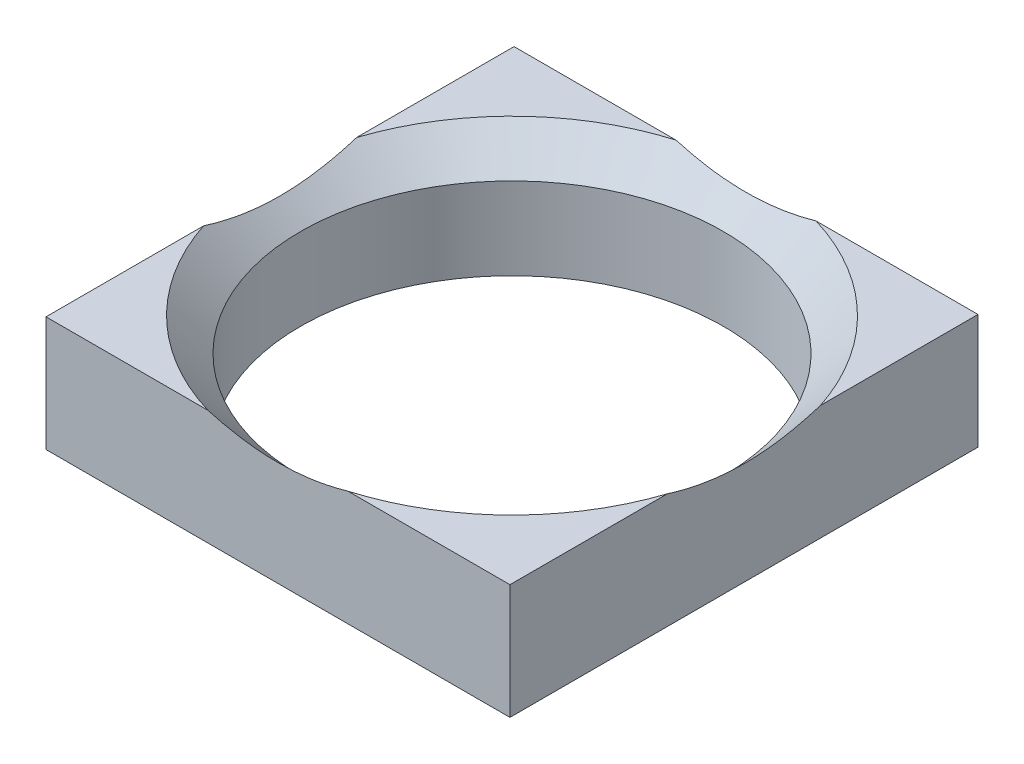
ISO-10303-21;
HEADER;
FILE_DESCRIPTION(('STEP AP214'),'2;1');
FILE_NAME('part.step','',(''),(''),'','','');
FILE_SCHEMA(('AUTOMOTIVE_DESIGN { 1 0 10303 214 1 1 1 1 }'));
ENDSEC;
DATA;
#1=APPLICATION_CONTEXT('core data for automotive mechanical design processes');
#2=APPLICATION_PROTOCOL_DEFINITION('international standard','automotive_design',2000,#1);
#3=PRODUCT_CONTEXT('',#1,'mechanical');
#4=PRODUCT('Part','Part','',(#3));
#5=PRODUCT_RELATED_PRODUCT_CATEGORY('part','',(#4));
#6=PRODUCT_DEFINITION_FORMATION('','',#4);
#7=PRODUCT_DEFINITION_CONTEXT('part definition',#1,'design');
#8=PRODUCT_DEFINITION('design','',#6,#7);
#9=PRODUCT_DEFINITION_SHAPE('','',#8);
#10=(LENGTH_UNIT() NAMED_UNIT(*) SI_UNIT(.MILLI.,.METRE.));
#11=(NAMED_UNIT(*) PLANE_ANGLE_UNIT() SI_UNIT($,.RADIAN.));
#12=(NAMED_UNIT(*) SI_UNIT($,.STERADIAN.) SOLID_ANGLE_UNIT());
#13=UNCERTAINTY_MEASURE_WITH_UNIT(LENGTH_MEASURE(1.E-05),#10,'distance_accuracy_value','');
#14=(GEOMETRIC_REPRESENTATION_CONTEXT(3) GLOBAL_UNCERTAINTY_ASSIGNED_CONTEXT((#13)) GLOBAL_UNIT_ASSIGNED_CONTEXT((#10,
#11,#12)) REPRESENTATION_CONTEXT('',''));
#15=CARTESIAN_POINT('',(0.,0.,0.));
#16=DIRECTION('',(0.,0.,1.));
#17=DIRECTION('',(1.,0.,0.));
#18=AXIS2_PLACEMENT_3D('',#15,#16,#17);
#19=CARTESIAN_POINT('',(0.,2.8,0.));
#20=DIRECTION('',(0.,1.,0.));
#21=DIRECTION('',(0.,0.,1.));
#22=AXIS2_PLACEMENT_3D('',#19,#20,#21);
#23=PLANE('',#22);
#24=DIRECTION('',(0.,0.,1.));
#25=VECTOR('',#24,1.);
#26=CARTESIAN_POINT('',(-5.65,2.8,-5.7));
#27=LINE('',#26,#25);
#28=CARTESIAN_POINT('',(-5.65,2.8,1.86547581061778));
#29=VERTEX_POINT('',#28);
#30=CARTESIAN_POINT('',(-5.65,2.8,5.7));
#31=VERTEX_POINT('',#30);
#32=EDGE_CURVE('E159',#29,#31,#27,.T.);
#33=ORIENTED_EDGE('',*,*,#32,.T.);
#34=DIRECTION('',(1.,0.,0.));
#35=VECTOR('',#34,1.);
#36=CARTESIAN_POINT('',(-5.65,2.8,5.7));
#37=LINE('',#36,#35);
#38=CARTESIAN_POINT('',(-1.70660481658761,2.8,5.7));
#39=VERTEX_POINT('',#38);
#40=EDGE_CURVE('E125',#31,#39,#37,.T.);
#41=ORIENTED_EDGE('',*,*,#40,.T.);
#42=CARTESIAN_POINT('',(0.,2.8,0.));
#43=DIRECTION('',(0.,1.,0.));
#44=DIRECTION('',(0.,0.,1.));
#45=AXIS2_PLACEMENT_3D('',#42,#43,#44);
#46=CIRCLE('',#45,5.95000000000001);
#47=EDGE_CURVE('E183',#39,#29,#46,.F.);
#48=ORIENTED_EDGE('',*,*,#47,.T.);
#49=EDGE_LOOP('',(#33,#41,#48));
#50=FACE_BOUND('',#49,.T.);
#51=ADVANCED_FACE('F50',(#50),#23,.T.);
#52=DIRECTION('',(-1.,0.,0.));
#53=VECTOR('',#52,1.);
#54=CARTESIAN_POINT('',(-5.65,2.8,-5.7));
#55=LINE('',#54,#53);
#56=CARTESIAN_POINT('',(-1.70660481658762,2.8,-5.7));
#57=VERTEX_POINT('',#56);
#58=CARTESIAN_POINT('',(-5.65,2.8,-5.7));
#59=VERTEX_POINT('',#58);
#60=EDGE_CURVE('E77',#57,#59,#55,.T.);
#61=ORIENTED_EDGE('',*,*,#60,.T.);
#62=CARTESIAN_POINT('',(-5.65,2.8,-1.86547581061778));
#63=VERTEX_POINT('',#62);
#64=EDGE_CURVE('E160',#59,#63,#27,.T.);
#65=ORIENTED_EDGE('',*,*,#64,.T.);
#66=CARTESIAN_POINT('',(0.,2.8,0.));
#67=DIRECTION('',(0.,1.,0.));
#68=DIRECTION('',(0.,0.,1.));
#69=AXIS2_PLACEMENT_3D('',#66,#67,#68);
#70=CIRCLE('',#69,5.95000000000001);
#71=EDGE_CURVE('E179',#63,#57,#70,.F.);
#72=ORIENTED_EDGE('',*,*,#71,.T.);
#73=EDGE_LOOP('',(#61,#65,#72));
#74=FACE_BOUND('',#73,.T.);
#75=ADVANCED_FACE('F234',(#74),#23,.T.);
#76=CARTESIAN_POINT('',(0.,2.8,0.));
#77=DIRECTION('',(0.,1.,0.));
#78=DIRECTION('',(0.,0.,1.));
#79=AXIS2_PLACEMENT_3D('',#76,#77,#78);
#80=CIRCLE('',#79,5.95000000000001);
#81=CARTESIAN_POINT('',(1.70660481658763,2.8,-5.7));
#82=VERTEX_POINT('',#81);
#83=CARTESIAN_POINT('',(5.65,2.8,-1.86547581061778));
#84=VERTEX_POINT('',#83);
#85=EDGE_CURVE('E175',#82,#84,#80,.F.);
#86=ORIENTED_EDGE('',*,*,#85,.T.);
#87=DIRECTION('',(0.,0.,-1.));
#88=VECTOR('',#87,1.);
#89=CARTESIAN_POINT('',(5.65,2.8,-5.7));
#90=LINE('',#89,#88);
#91=CARTESIAN_POINT('',(5.65,2.8,-5.7));
#92=VERTEX_POINT('',#91);
#93=EDGE_CURVE('E154',#84,#92,#90,.T.);
#94=ORIENTED_EDGE('',*,*,#93,.T.);
#95=EDGE_CURVE('E155',#92,#82,#55,.T.);
#96=ORIENTED_EDGE('',*,*,#95,.T.);
#97=EDGE_LOOP('',(#86,#94,#96));
#98=FACE_BOUND('',#97,.T.);
#99=ADVANCED_FACE('F240',(#98),#23,.T.);
#100=CARTESIAN_POINT('',(1.70660481658762,2.8,5.7));
#101=VERTEX_POINT('',#100);
#102=CARTESIAN_POINT('',(5.65,2.8,5.7));
#103=VERTEX_POINT('',#102);
#104=EDGE_CURVE('E164',#101,#103,#37,.T.);
#105=ORIENTED_EDGE('',*,*,#104,.T.);
#106=CARTESIAN_POINT('',(5.65,2.8,1.86547581061778));
#107=VERTEX_POINT('',#106);
#108=EDGE_CURVE('E150',#103,#107,#90,.T.);
#109=ORIENTED_EDGE('',*,*,#108,.T.);
#110=CARTESIAN_POINT('',(0.,2.8,0.));
#111=DIRECTION('',(0.,1.,0.));
#112=DIRECTION('',(0.,0.,1.));
#113=AXIS2_PLACEMENT_3D('',#110,#111,#112);
#114=CIRCLE('',#113,5.95000000000001);
#115=EDGE_CURVE('E168',#107,#101,#114,.F.);
#116=ORIENTED_EDGE('',*,*,#115,.T.);
#117=EDGE_LOOP('',(#105,#109,#116));
#118=FACE_BOUND('',#117,.T.);
#119=ADVANCED_FACE('F236',(#118),#23,.T.);
#120=CARTESIAN_POINT('',(0.,0.,0.));
#121=DIRECTION('',(0.,1.,0.));
#122=DIRECTION('',(0.,0.,1.));
#123=AXIS2_PLACEMENT_3D('',#120,#121,#122);
#124=PLANE('',#123);
#125=CARTESIAN_POINT('',(0.,0.,0.));
#126=DIRECTION('',(0.,1.,0.));
#127=DIRECTION('',(0.,0.,1.));
#128=AXIS2_PLACEMENT_3D('',#125,#126,#127);
#129=CIRCLE('',#128,5.15);
#130=CARTESIAN_POINT('',(0.,0.,5.15));
#131=VERTEX_POINT('',#130);
#132=EDGE_CURVE('E261',#131,#131,#129,.T.);
#133=ORIENTED_EDGE('',*,*,#132,.T.);
#134=EDGE_LOOP('',(#133));
#135=FACE_BOUND('',#134,.T.);
#136=DIRECTION('',(0.,0.,-1.));
#137=VECTOR('',#136,1.);
#138=CARTESIAN_POINT('',(5.65,0.,-5.7));
#139=LINE('',#138,#137);
#140=CARTESIAN_POINT('',(5.65,0.,5.7));
#141=VERTEX_POINT('',#140);
#142=CARTESIAN_POINT('',(5.65,0.,-5.7));
#143=VERTEX_POINT('',#142);
#144=EDGE_CURVE('E69',#141,#143,#139,.T.);
#145=ORIENTED_EDGE('',*,*,#144,.F.);
#146=DIRECTION('',(1.,0.,0.));
#147=VECTOR('',#146,1.);
#148=CARTESIAN_POINT('',(-5.65,0.,5.7));
#149=LINE('',#148,#147);
#150=CARTESIAN_POINT('',(-5.65,0.,5.7));
#151=VERTEX_POINT('',#150);
#152=EDGE_CURVE('E123',#151,#141,#149,.T.);
#153=ORIENTED_EDGE('',*,*,#152,.F.);
#154=DIRECTION('',(0.,0.,1.));
#155=VECTOR('',#154,1.);
#156=CARTESIAN_POINT('',(-5.65,0.,-5.7));
#157=LINE('',#156,#155);
#158=CARTESIAN_POINT('',(-5.65,0.,-5.7));
#159=VERTEX_POINT('',#158);
#160=EDGE_CURVE('E133',#159,#151,#157,.T.);
#161=ORIENTED_EDGE('',*,*,#160,.F.);
#162=DIRECTION('',(-1.,0.,0.));
#163=VECTOR('',#162,1.);
#164=CARTESIAN_POINT('',(-5.65,0.,-5.7));
#165=LINE('',#164,#163);
#166=EDGE_CURVE('E140',#143,#159,#165,.T.);
#167=ORIENTED_EDGE('',*,*,#166,.F.);
#168=EDGE_LOOP('',(#145,#153,#161,#167));
#169=FACE_BOUND('',#168,.T.);
#170=ADVANCED_FACE('F142',(#135,#169),#124,.F.);
#171=CARTESIAN_POINT('',(0.,1.9,0.));
#172=DIRECTION('',(0.,1.,0.));
#173=DIRECTION('',(0.,0.,1.));
#174=AXIS2_PLACEMENT_3D('',#171,#172,#173);
#175=CONICAL_SURFACE('',#174,5.05,0.785398163397449);
#176=CARTESIAN_POINT('',(0.,2.,0.));
#177=DIRECTION('',(0.,1.,0.));
#178=DIRECTION('',(0.,0.,1.));
#179=AXIS2_PLACEMENT_3D('',#176,#177,#178);
#180=CIRCLE('',#179,5.15);
#181=CARTESIAN_POINT('',(0.,2.,5.15));
#182=VERTEX_POINT('',#181);
#183=EDGE_CURVE('E56',#182,#182,#180,.T.);
#184=ORIENTED_EDGE('',*,*,#183,.F.);
#185=EDGE_LOOP('',(#184));
#186=FACE_BOUND('',#185,.T.);
#187=ORIENTED_EDGE('',*,*,#115,.F.);
#188=CARTESIAN_POINT('',(5.65,14.2356711315276,16.4419907764733));
#189=CARTESIAN_POINT('',(5.65,13.9834431608052,16.175280783346));
#190=CARTESIAN_POINT('',(5.65,13.7315513959607,15.9082525352937));
#191=CARTESIAN_POINT('',(5.65,13.2285582947579,15.3734497304002));
#192=CARTESIAN_POINT('',(5.65,12.9774569631199,15.1056751691202));
#193=CARTESIAN_POINT('',(5.65,12.224979271577,14.3004933264489));
#194=CARTESIAN_POINT('',(5.65,11.7249740297578,13.7618029655425));
#195=CARTESIAN_POINT('',(5.65,10.7102549722765,12.6583310669776));
#196=CARTESIAN_POINT('',(5.65,10.195744291636,12.0933620750663));
#197=CARTESIAN_POINT('',(5.65,9.43024123348055,11.2407927536298));
#198=CARTESIAN_POINT('',(5.65,9.17624199182825,10.9558931278892));
#199=CARTESIAN_POINT('',(5.65,8.67073539087396,10.3838940481738));
#200=CARTESIAN_POINT('',(5.65,8.41922800526204,10.0967946174824));
#201=CARTESIAN_POINT('',(5.65,7.91965168161561,9.52026106112165));
#202=CARTESIAN_POINT('',(5.65,7.67157873905613,9.23083041115858));
#203=CARTESIAN_POINT('',(5.65,7.17939406809234,8.64858934151295));
#204=CARTESIAN_POINT('',(5.65,6.93528253264345,8.3557787583796));
#205=CARTESIAN_POINT('',(5.65,6.45145584700999,7.76494295627826));
#206=CARTESIAN_POINT('',(5.65,6.21175753898278,7.46690389613502));
#207=CARTESIAN_POINT('',(5.65,5.73937875355495,6.86536654384135));
#208=CARTESIAN_POINT('',(5.65,5.50669727052154,6.56186904402884));
#209=CARTESIAN_POINT('',(5.65,5.05511143160943,5.95334575659136));
#210=CARTESIAN_POINT('',(5.65,4.8360322952248,5.64845098293372));
#211=CARTESIAN_POINT('',(5.65,4.51719769270429,5.18420517330077));
#212=CARTESIAN_POINT('',(5.65,4.41251003273822,5.0282418298104));
#213=CARTESIAN_POINT('',(5.65,4.20713017558806,4.71371197537741));
#214=CARTESIAN_POINT('',(5.65,4.10643769667206,4.55514564911057));
#215=CARTESIAN_POINT('',(5.65,3.910435140708,4.23592074650746));
#216=CARTESIAN_POINT('',(5.65,3.81509828773573,4.07527867107234));
#217=CARTESIAN_POINT('',(5.65,3.63025870034071,3.75062950189142));
#218=CARTESIAN_POINT('',(5.65,3.54075664064924,3.58662202184565));
#219=CARTESIAN_POINT('',(5.65,3.36906281350419,3.25511241107166));
#220=CARTESIAN_POINT('',(5.65,3.28686044661249,3.08761579825439));
#221=CARTESIAN_POINT('',(5.65,3.1312904287907,2.74859544695919));
#222=CARTESIAN_POINT('',(5.65,3.05791939411052,2.57707328117852));
#223=CARTESIAN_POINT('',(5.65,2.9572788205528,2.3199671921801));
#224=CARTESIAN_POINT('',(5.65,2.92585230357156,2.2360023204772));
#225=CARTESIAN_POINT('',(5.65,2.86574147786503,2.06709425942965));
#226=CARTESIAN_POINT('',(5.65,2.83705727306549,1.98215103314477));
#227=CARTESIAN_POINT('',(5.65,2.75548594548319,1.72583094912809));
#228=CARTESIAN_POINT('',(5.65,2.70708937306983,1.55298699668785));
#229=CARTESIAN_POINT('',(5.65,2.62458989854584,1.20490419696493));
#230=CARTESIAN_POINT('',(5.65,2.59040888624463,1.02968405043943));
#231=CARTESIAN_POINT('',(5.65,2.53773017720199,0.676880469439015));
#232=CARTESIAN_POINT('',(5.65,2.51923063897448,0.499297314942012));
#233=CARTESIAN_POINT('',(5.65,2.49893708983897,0.141735066467987));
#234=CARTESIAN_POINT('',(5.65,2.49727792886429,-0.0382518291330582));
#235=CARTESIAN_POINT('',(5.65,2.51112262600359,-0.397549856811444));
#236=CARTESIAN_POINT('',(5.65,2.52662637884385,-0.576860993026981));
#237=CARTESIAN_POINT('',(5.65,2.57394371156385,-0.93409870929561));
#238=CARTESIAN_POINT('',(5.65,2.60582982507905,-1.11201552894643));
#239=CARTESIAN_POINT('',(5.65,2.68420344489631,-1.4645851807568));
#240=CARTESIAN_POINT('',(5.65,2.73069422713209,-1.63923727129227));
#241=CARTESIAN_POINT('',(5.65,2.86514169336354,-2.07951043743523));
#242=CARTESIAN_POINT('',(5.65,2.96185232949413,-2.34244938461772));
#243=CARTESIAN_POINT('',(5.65,3.17776408756711,-2.85890206246326));
#244=CARTESIAN_POINT('',(5.65,3.29698268633535,-3.11240828452949));
#245=CARTESIAN_POINT('',(5.65,3.48877199544683,-3.48746647604352));
#246=CARTESIAN_POINT('',(5.65,3.55521901631738,-3.61221567447878));
#247=CARTESIAN_POINT('',(5.65,3.69173193110206,-3.85972383098038));
#248=CARTESIAN_POINT('',(5.65,3.76179787114567,-3.98248276365106));
#249=CARTESIAN_POINT('',(5.65,3.9049903230094,-4.22612079987853));
#250=CARTESIAN_POINT('',(5.65,3.97811544264934,-4.34700072491578));
#251=CARTESIAN_POINT('',(5.65,4.12702707343492,-4.58709860951872));
#252=CARTESIAN_POINT('',(5.65,4.20281347208269,-4.70631663903932));
#253=CARTESIAN_POINT('',(5.65,4.46282941451896,-5.10674144186432));
#254=CARTESIAN_POINT('',(5.65,4.6524011642967,-5.38448418861714));
#255=CARTESIAN_POINT('',(5.65,5.04086297982449,-5.93339979935816));
#256=CARTESIAN_POINT('',(5.65,5.23975524827823,-6.20457108711733));
#257=CARTESIAN_POINT('',(5.65,5.64458790808262,-6.74192070421842));
#258=CARTESIAN_POINT('',(5.65,5.85053376541595,-7.00809490209259));
#259=CARTESIAN_POINT('',(5.65,6.26763124325532,-7.5362786592922));
#260=CARTESIAN_POINT('',(5.65,6.47878240506643,-7.79828858225348));
#261=CARTESIAN_POINT('',(5.65,6.90585933349731,-8.3198726193851));
#262=CARTESIAN_POINT('',(5.65,7.12179891213739,-8.57943539860998));
#263=CARTESIAN_POINT('',(5.65,7.55689840360805,-9.0958507678333));
#264=CARTESIAN_POINT('',(5.65,7.77605837634234,-9.35270330726452));
#265=CARTESIAN_POINT('',(5.65,8.21685962774348,-9.86406523435232));
#266=CARTESIAN_POINT('',(5.65,8.43849974126684,-10.1185756277062));
#267=CARTESIAN_POINT('',(5.65,8.88388433431273,-10.6257496062947));
#268=CARTESIAN_POINT('',(5.65,9.10762882991348,-10.8784131773928));
#269=CARTESIAN_POINT('',(5.65,9.73450695168554,-11.581445985536));
#270=CARTESIAN_POINT('',(5.65,10.1395463643158,-12.0301155339244));
#271=CARTESIAN_POINT('',(5.65,10.9536983675994,-12.9238392013321));
#272=CARTESIAN_POINT('',(5.65,11.3628114727187,-13.3688928504743));
#273=CARTESIAN_POINT('',(5.65,12.181287503301,-14.2532041625837));
#274=CARTESIAN_POINT('',(5.65,12.5906300916334,-14.6924806703086));
#275=CARTESIAN_POINT('',(5.65,13.4115893168912,-15.5687714350527));
#276=CARTESIAN_POINT('',(5.65,13.8232055759963,-16.0057860458666));
#277=CARTESIAN_POINT('',(5.65,14.2356711315276,-16.4419907764733));
#278=B_SPLINE_CURVE_WITH_KNOTS('',3,(#188,#189,#190,#191,#192,#193,#194,#195,#196,#197,#198,
#199,#200,#201,#202,#203,#204,#205,#206,#207,#208,#209,#210,#211,#212,#213,#214,#215,#216,#217,
#218,#219,#220,#221,#222,#223,#224,#225,#226,#227,#228,#229,#230,#231,#232,#233,#234,#235,#236,
#237,#238,#239,#240,#241,#242,#243,#244,#245,#246,#247,#248,#249,#250,#251,#252,#253,#254,#255,
#256,#257,#258,#259,#260,#261,#262,#263,#264,#265,#266,#267,#268,#269,#270,#271,#272,#273,#274,
#275,#276,#277),.UNSPECIFIED.,.F.,.F.,(4,2,2,2,2,2,2,2,2,2,2,2,2,2,2,2,2,2,2,2,2,2,2,2,2,2,2,2,
2,2,2,2,2,2,2,2,2,2,2,2,2,2,2,2,4),(0.,1.10126213544741,2.20253083484356,4.40744470841247,
6.69980643957724,7.84485030770269,8.98988207311766,10.1334418923467,11.2770572468221,
12.4243846631025,13.5715468583633,14.6975885010549,15.2610628563013,15.8244974056205,
16.384804209616,16.9451756925721,17.504719714598,18.0640486586338,18.3329667931033,
18.6018951147608,19.1398268551158,19.6747624742339,20.2096352667958,20.7487877257797,
21.2879368777338,21.8294939755765,22.3711726354685,23.2101457263906,24.0497729566531,
24.4737511022856,24.8977346535982,25.3215273126121,25.7453020785315,26.7538090904397,
27.7625556551845,28.7721024397947,29.7815605782384,30.7944567030651,31.8073716930481,
32.8198292923211,33.8322946334174,35.6456104090566,37.4591581681485,39.2604611416385,
41.0614732908355),.UNSPECIFIED.);
#279=EDGE_CURVE('E12',#107,#84,#278,.T.);
#280=ORIENTED_EDGE('',*,*,#279,.T.);
#281=ORIENTED_EDGE('',*,*,#85,.F.);
#282=CARTESIAN_POINT('',(16.3191680098527,14.1359840487546,-5.7));
#283=CARTESIAN_POINT('',(16.0569617222666,13.8884481796756,-5.7));
#284=CARTESIAN_POINT('',(15.7944367984937,13.6412495257761,-5.7));
#285=CARTESIAN_POINT('',(15.2686414500865,13.1476433278169,-5.7));
#286=CARTESIAN_POINT('',(15.0053710210415,12.9012357884564,-5.7));
#287=CARTESIAN_POINT('',(14.2137906429992,12.1629192880823,-5.7));
#288=CARTESIAN_POINT('',(13.6842015768552,11.672379826128,-5.7));
#289=CARTESIAN_POINT('',(12.6022328157818,10.6796106912601,-5.7));
#290=CARTESIAN_POINT('',(12.0496930502591,10.1775548706294,-5.7));
#291=CARTESIAN_POINT('',(11.2158552212608,9.430554106288,-5.7));
#292=CARTESIAN_POINT('',(10.9371900220354,9.1826711073318,-5.7));
#293=CARTESIAN_POINT('',(10.377724259114,8.68932861989904,-5.7));
#294=CARTESIAN_POINT('',(10.096923715028,8.44386910921374,-5.7));
#295=CARTESIAN_POINT('',(9.53299733915615,7.95621460388212,-5.7));
#296=CARTESIAN_POINT('',(9.24987416490724,7.71401654091263,-5.7));
#297=CARTESIAN_POINT('',(8.68038339313063,7.23343356715659,-5.7));
#298=CARTESIAN_POINT('',(8.39401566231841,6.99504881399591,-5.7));
#299=CARTESIAN_POINT('',(7.81642059050429,6.52257574329108,-5.7));
#300=CARTESIAN_POINT('',(7.5251819991805,6.2885011327738,-5.7));
#301=CARTESIAN_POINT('',(6.9375352802732,5.8269866725349,-5.7));
#302=CARTESIAN_POINT('',(6.64112778130061,5.59954602489932,-5.7));
#303=CARTESIAN_POINT('',(6.04616754326133,5.15704968823395,-5.7));
#304=CARTESIAN_POINT('',(5.74771713506303,4.941857691626,-5.7));
#305=CARTESIAN_POINT('',(5.29359133031512,4.62818794593662,-5.7));
#306=CARTESIAN_POINT('',(5.14108790831103,4.52511747140244,-5.7));
#307=CARTESIAN_POINT('',(4.83365372605299,4.32267017812123,-5.7));
#308=CARTESIAN_POINT('',(4.67872311642068,4.22329313145522,-5.7));
#309=CARTESIAN_POINT('',(4.36682987748475,4.02943955356524,-5.7));
#310=CARTESIAN_POINT('',(4.20988029423562,3.93494210211081,-5.7));
#311=CARTESIAN_POINT('',(3.89285678455552,3.75127783633262,-5.7));
#312=CARTESIAN_POINT('',(3.73278255471576,3.66211154312382,-5.7));
#313=CARTESIAN_POINT('',(3.40935907254307,3.49040446682783,-5.7));
#314=CARTESIAN_POINT('',(3.24601415051027,3.40785556486246,-5.7));
#315=CARTESIAN_POINT('',(2.91555645336341,3.25073048076243,-5.7));
#316=CARTESIAN_POINT('',(2.74844491440723,3.1761517277586,-5.7));
#317=CARTESIAN_POINT('',(2.49438346550459,3.07141195974828,-5.7));
#318=CARTESIAN_POINT('',(2.40892626487645,3.03761596827938,-5.7));
#319=CARTESIAN_POINT('',(2.23699045751278,2.97272692665027,-5.7));
#320=CARTESIAN_POINT('',(2.15051182313482,2.9416339498313,-5.7));
#321=CARTESIAN_POINT('',(1.88950855225789,2.85278964187801,-5.7));
#322=CARTESIAN_POINT('',(1.71343399667137,2.79948023369896,-5.7));
#323=CARTESIAN_POINT('',(1.35859349566342,2.70718532760334,-5.7));
#324=CARTESIAN_POINT('',(1.17984835761074,2.6681206591899,-5.7));
#325=CARTESIAN_POINT('',(0.819584338433574,2.60589036111064,-5.7));
#326=CARTESIAN_POINT('',(0.638065786703127,2.5827228581395,-5.7));
#327=CARTESIAN_POINT('',(0.271799401917556,2.55352879244794,-5.7));
#328=CARTESIAN_POINT('',(0.0870374320366984,2.54767613641807,-5.7));
#329=CARTESIAN_POINT('',(-0.282164903358449,2.55399368560354,-5.7));
#330=CARTESIAN_POINT('',(-0.466605279323058,2.56616329382341,-5.7));
#331=CARTESIAN_POINT('',(-0.834256897434177,2.60781777840016,-5.7));
#332=CARTESIAN_POINT('',(-1.01745994604432,2.63737377920101,-5.7));
#333=CARTESIAN_POINT('',(-1.38063206920966,2.71212600788908,-5.7));
#334=CARTESIAN_POINT('',(-1.56060031389964,2.75732619059482,-5.7));
#335=CARTESIAN_POINT('',(-2.00103923470839,2.88581985032233,-5.7));
#336=CARTESIAN_POINT('',(-2.25919514495635,2.9770121205502,-5.7));
#337=CARTESIAN_POINT('',(-2.7665091563681,3.18162759194298,-5.7));
#338=CARTESIAN_POINT('',(-3.01566085496749,3.29506625717413,-5.7));
#339=CARTESIAN_POINT('',(-3.38442287061537,3.47818471236272,-5.7));
#340=CARTESIAN_POINT('',(-3.50713706308212,3.54174697898983,-5.7));
#341=CARTESIAN_POINT('',(-3.75061951740395,3.67250588900941,-5.7));
#342=CARTESIAN_POINT('',(-3.87138775467358,3.73970257827299,-5.7));
#343=CARTESIAN_POINT('',(-4.1110780871344,3.87718503764,-5.7));
#344=CARTESIAN_POINT('',(-4.23000093823526,3.94746949517001,-5.7));
#345=CARTESIAN_POINT('',(-4.46620245947555,4.09072960809888,-5.7));
#346=CARTESIAN_POINT('',(-4.58348120571218,4.16370513837037,-5.7));
#347=CARTESIAN_POINT('',(-4.98388311998761,4.41841826778278,-5.7));
#348=CARTESIAN_POINT('',(-5.26336793310482,4.60588459518438,-5.7));
#349=CARTESIAN_POINT('',(-5.81548562357891,4.99068724128139,-5.7));
#350=CARTESIAN_POINT('',(-6.08811666461475,5.18802616365947,-5.7));
#351=CARTESIAN_POINT('',(-6.62818271156639,5.5901549408409,-5.7));
#352=CARTESIAN_POINT('',(-6.89561291528915,5.79495122286433,-5.7));
#353=CARTESIAN_POINT('',(-7.42612473770021,6.21002540627748,-5.7));
#354=CARTESIAN_POINT('',(-7.6892067800932,6.42030276835799,-5.7));
#355=CARTESIAN_POINT('',(-8.21288413193707,6.84590522351156,-5.7));
#356=CARTESIAN_POINT('',(-8.47346645260195,7.06124626046626,-5.7));
#357=CARTESIAN_POINT('',(-8.99180642521476,7.49530562848765,-5.7));
#358=CARTESIAN_POINT('',(-9.24956401834101,7.71402402965642,-5.7));
#359=CARTESIAN_POINT('',(-9.76263084554002,8.15405106699877,-5.7));
#360=CARTESIAN_POINT('',(-10.0179412441684,8.37535834719775,-5.7));
#361=CARTESIAN_POINT('',(-10.526641578074,8.82017066025747,-5.7));
#362=CARTESIAN_POINT('',(-10.7800314973698,9.04367571137151,-5.7));
#363=CARTESIAN_POINT('',(-11.481971022725,9.66729098052832,-5.7));
#364=CARTESIAN_POINT('',(-11.9287889176635,10.0693499980396,-5.7));
#365=CARTESIAN_POINT('',(-12.8187242680538,10.8776573401101,-5.7));
#366=CARTESIAN_POINT('',(-13.2618411906965,11.283906249673,-5.7));
#367=CARTESIAN_POINT('',(-14.1419363521196,12.0965085371376,-5.7));
#368=CARTESIAN_POINT('',(-14.5789357595032,12.5028390060424,-5.7));
#369=CARTESIAN_POINT('',(-15.2327322551373,13.1140765245982,-5.7));
#370=CARTESIAN_POINT('',(-15.4503616759935,13.318094732259,-5.7));
#371=CARTESIAN_POINT('',(-15.8851231945617,13.7266591590601,-5.7));
#372=CARTESIAN_POINT('',(-16.1022552937001,13.9312053766825,-5.7));
#373=CARTESIAN_POINT('',(-16.3191680098527,14.1359840487546,-5.7));
#374=B_SPLINE_CURVE_WITH_KNOTS('',3,(#282,#283,#284,#285,#286,#287,#288,#289,#290,#291,#292,
#293,#294,#295,#296,#297,#298,#299,#300,#301,#302,#303,#304,#305,#306,#307,#308,#309,#310,#311,
#312,#313,#314,#315,#316,#317,#318,#319,#320,#321,#322,#323,#324,#325,#326,#327,#328,#329,#330,
#331,#332,#333,#334,#335,#336,#337,#338,#339,#340,#341,#342,#343,#344,#345,#346,#347,#348,#349,
#350,#351,#352,#353,#354,#355,#356,#357,#358,#359,#360,#361,#362,#363,#364,#365,#366,#367,#368,
#369,#370,#371,#372,#373),.UNSPECIFIED.,.F.,.F.,(4,2,2,2,2,2,2,2,2,2,2,2,2,2,2,2,2,2,2,2,2,2,2,
2,2,2,2,2,2,2,2,2,2,2,2,2,2,2,2,2,2,2,2,2,2,4),(0.,1.08177400293109,2.16355441959082,
4.32913837033511,6.5687756752402,7.68764945739707,8.80651297670905,9.92423772709524,
11.042008560659,12.1628710015134,13.2835980676369,14.3871657556304,14.9393264207026,
15.4914529555408,16.0409729293133,16.5905465305463,17.1394351978838,17.688146276641,
17.9637973465152,18.2394558933328,18.7908296209696,19.3390904106602,19.8872865827739,
20.4409703384633,20.9946357535432,21.5505820164105,22.1066689241796,22.9265776394523,
23.7470583285029,24.1616063535396,24.5761596119275,24.9905383222592,25.4048977893741,
26.4141584640811,27.4236867271305,28.4341066750823,29.4444275755934,30.4585290080696,
31.4726515180559,32.4862647368933,33.4998863812912,35.3030873724711,37.1065436346668,
38.8966868671455,39.7916018291449,40.6865142212676),.UNSPECIFIED.);
#375=EDGE_CURVE('E187',#82,#57,#374,.T.);
#376=ORIENTED_EDGE('',*,*,#375,.T.);
#377=ORIENTED_EDGE('',*,*,#71,.F.);
#378=CARTESIAN_POINT('',(-5.65,14.2356711315276,-16.4419907764732));
#379=CARTESIAN_POINT('',(-5.65,13.9834431608052,-16.175280783346));
#380=CARTESIAN_POINT('',(-5.65,13.7315513959606,-15.9082525352937));
#381=CARTESIAN_POINT('',(-5.65,13.2285582947579,-15.3734497304002));
#382=CARTESIAN_POINT('',(-5.65,12.9774569631199,-15.1056751691202));
#383=CARTESIAN_POINT('',(-5.65,12.224979271577,-14.3004933264489));
#384=CARTESIAN_POINT('',(-5.65,11.7249740297578,-13.7618029655425));
#385=CARTESIAN_POINT('',(-5.65,10.7102549722765,-12.6583310669776));
#386=CARTESIAN_POINT('',(-5.65,10.195744291636,-12.0933620750663));
#387=CARTESIAN_POINT('',(-5.65,9.43024123348055,-11.2407927536298));
#388=CARTESIAN_POINT('',(-5.65,9.17624199182825,-10.9558931278892));
#389=CARTESIAN_POINT('',(-5.65,8.67073539087397,-10.3838940481738));
#390=CARTESIAN_POINT('',(-5.65,8.41922800526205,-10.0967946174824));
#391=CARTESIAN_POINT('',(-5.65,7.91965168161562,-9.52026106112166));
#392=CARTESIAN_POINT('',(-5.65,7.67157873905613,-9.2308304111586));
#393=CARTESIAN_POINT('',(-5.65,7.17939406809235,-8.64858934151297));
#394=CARTESIAN_POINT('',(-5.65,6.93528253264346,-8.35577875837962));
#395=CARTESIAN_POINT('',(-5.65,6.45145584701001,-7.76494295627829));
#396=CARTESIAN_POINT('',(-5.65,6.2117575389828,-7.46690389613505));
#397=CARTESIAN_POINT('',(-5.65,5.73937875355497,-6.86536654384137));
#398=CARTESIAN_POINT('',(-5.65,5.50669727052156,-6.56186904402887));
#399=CARTESIAN_POINT('',(-5.65,5.05511143160945,-5.95334575659139));
#400=CARTESIAN_POINT('',(-5.65,4.83603229522482,-5.64845098293375));
#401=CARTESIAN_POINT('',(-5.65,4.51719769270432,-5.18420517330081));
#402=CARTESIAN_POINT('',(-5.65,4.41251003273824,-5.02824182981044));
#403=CARTESIAN_POINT('',(-5.65,4.20713017558809,-4.71371197537744));
#404=CARTESIAN_POINT('',(-5.65,4.10643769667208,-4.55514564911061));
#405=CARTESIAN_POINT('',(-5.65,3.91043514070802,-4.2359207465075));
#406=CARTESIAN_POINT('',(-5.65,3.81509828773575,-4.07527867107238));
#407=CARTESIAN_POINT('',(-5.65,3.63025870034073,-3.75062950189146));
#408=CARTESIAN_POINT('',(-5.65,3.54075664064927,-3.58662202184569));
#409=CARTESIAN_POINT('',(-5.65,3.36906281350421,-3.2551124110717));
#410=CARTESIAN_POINT('',(-5.65,3.28686044661251,-3.08761579825442));
#411=CARTESIAN_POINT('',(-5.65,3.13129042879072,-2.74859544695922));
#412=CARTESIAN_POINT('',(-5.65,3.05791939411054,-2.57707328117856));
#413=CARTESIAN_POINT('',(-5.65,2.95727882055282,-2.31996719218015));
#414=CARTESIAN_POINT('',(-5.65,2.92585230357158,-2.23600232047724));
#415=CARTESIAN_POINT('',(-5.65,2.86574147786504,-2.0670942594297));
#416=CARTESIAN_POINT('',(-5.65,2.8370572730655,-1.98215103314481));
#417=CARTESIAN_POINT('',(-5.65,2.7554859454832,-1.72583094912813));
#418=CARTESIAN_POINT('',(-5.65,2.70708937306985,-1.5529869966879));
#419=CARTESIAN_POINT('',(-5.65,2.62458989854585,-1.20490419696498));
#420=CARTESIAN_POINT('',(-5.65,2.59040888624464,-1.02968405043947));
#421=CARTESIAN_POINT('',(-5.65,2.53773017720199,-0.676880469439055));
#422=CARTESIAN_POINT('',(-5.65,2.51923063897448,-0.499297314942051));
#423=CARTESIAN_POINT('',(-5.65,2.49893708983898,-0.141735066468024));
#424=CARTESIAN_POINT('',(-5.65,2.4972779288643,0.0382518291330227));
#425=CARTESIAN_POINT('',(-5.65,2.51112262600359,0.397549856811409));
#426=CARTESIAN_POINT('',(-5.65,2.52662637884385,0.576860993026947));
#427=CARTESIAN_POINT('',(-5.65,2.57394371156385,0.934098709295577));
#428=CARTESIAN_POINT('',(-5.65,2.60582982507905,1.1120155289464));
#429=CARTESIAN_POINT('',(-5.65,2.6842034448963,1.46458518075677));
#430=CARTESIAN_POINT('',(-5.65,2.73069422713208,1.63923727129224));
#431=CARTESIAN_POINT('',(-5.65,2.86514169336353,2.0795104374352));
#432=CARTESIAN_POINT('',(-5.65,2.96185232949412,2.34244938461769));
#433=CARTESIAN_POINT('',(-5.65,3.1777640875671,2.85890206246322));
#434=CARTESIAN_POINT('',(-5.65,3.29698268633534,3.11240828452945));
#435=CARTESIAN_POINT('',(-5.65,3.48877199544681,3.48746647604348));
#436=CARTESIAN_POINT('',(-5.65,3.55521901631735,3.61221567447874));
#437=CARTESIAN_POINT('',(-5.65,3.69173193110203,3.85972383098033));
#438=CARTESIAN_POINT('',(-5.65,3.76179787114564,3.98248276365102));
#439=CARTESIAN_POINT('',(-5.65,3.90499032300938,4.22612079987848));
#440=CARTESIAN_POINT('',(-5.65,3.97811544264931,4.34700072491573));
#441=CARTESIAN_POINT('',(-5.65,4.12702707343489,4.58709860951867));
#442=CARTESIAN_POINT('',(-5.65,4.20281347208266,4.70631663903927));
#443=CARTESIAN_POINT('',(-5.65,4.46282941451893,5.10674144186427));
#444=CARTESIAN_POINT('',(-5.65,4.65240116429667,5.3844841886171));
#445=CARTESIAN_POINT('',(-5.65,5.04086297982447,5.93339979935812));
#446=CARTESIAN_POINT('',(-5.65,5.2397552482782,6.20457108711729));
#447=CARTESIAN_POINT('',(-5.65,5.6445879080826,6.74192070421839));
#448=CARTESIAN_POINT('',(-5.65,5.85053376541593,7.00809490209256));
#449=CARTESIAN_POINT('',(-5.65,6.2676312432553,7.53627865929217));
#450=CARTESIAN_POINT('',(-5.65,6.47878240506641,7.79828858225345));
#451=CARTESIAN_POINT('',(-5.65,6.90585933349729,8.31987261938507));
#452=CARTESIAN_POINT('',(-5.65,7.12179891213737,8.57943539860996));
#453=CARTESIAN_POINT('',(-5.65,7.55689840360803,9.09585076783328));
#454=CARTESIAN_POINT('',(-5.65,7.77605837634232,9.3527033072645));
#455=CARTESIAN_POINT('',(-5.65,8.21685962774347,9.8640652343523));
#456=CARTESIAN_POINT('',(-5.65,8.43849974126682,10.1185756277062));
#457=CARTESIAN_POINT('',(-5.65,8.88388433431272,10.6257496062947));
#458=CARTESIAN_POINT('',(-5.65,9.10762882991348,10.8784131773928));
#459=CARTESIAN_POINT('',(-5.65,9.73450695168554,11.581445985536));
#460=CARTESIAN_POINT('',(-5.65,10.1395463643158,12.0301155339244));
#461=CARTESIAN_POINT('',(-5.65,10.9536983675994,12.9238392013321));
#462=CARTESIAN_POINT('',(-5.65,11.3628114727187,13.3688928504743));
#463=CARTESIAN_POINT('',(-5.65,12.181287503301,14.2532041625837));
#464=CARTESIAN_POINT('',(-5.65,12.5906300916334,14.6924806703086));
#465=CARTESIAN_POINT('',(-5.65,13.4115893168912,15.5687714350527));
#466=CARTESIAN_POINT('',(-5.65,13.8232055759963,16.0057860458666));
#467=CARTESIAN_POINT('',(-5.65,14.2356711315276,16.4419907764733));
#468=B_SPLINE_CURVE_WITH_KNOTS('',3,(#378,#379,#380,#381,#382,#383,#384,#385,#386,#387,#388,
#389,#390,#391,#392,#393,#394,#395,#396,#397,#398,#399,#400,#401,#402,#403,#404,#405,#406,#407,
#408,#409,#410,#411,#412,#413,#414,#415,#416,#417,#418,#419,#420,#421,#422,#423,#424,#425,#426,
#427,#428,#429,#430,#431,#432,#433,#434,#435,#436,#437,#438,#439,#440,#441,#442,#443,#444,#445,
#446,#447,#448,#449,#450,#451,#452,#453,#454,#455,#456,#457,#458,#459,#460,#461,#462,#463,#464,
#465,#466,#467),.UNSPECIFIED.,.F.,.F.,(4,2,2,2,2,2,2,2,2,2,2,2,2,2,2,2,2,2,2,2,2,2,2,2,2,2,2,2,
2,2,2,2,2,2,2,2,2,2,2,2,2,2,2,2,4),(0.,1.10126213544741,2.20253083484356,4.40744470841246,
6.69980643957722,7.84485030770266,8.98988207311763,10.1334418923467,11.277057246822,
12.4243846631024,13.5715468583632,14.6975885010548,15.2610628563013,15.8244974056205,
16.3848042096159,16.9451756925721,17.504719714598,18.0640486586337,18.3329667931033,
18.6018951147607,19.1398268551157,19.6747624742339,20.2096352667958,20.7487877257797,
21.2879368777337,21.8294939755765,22.3711726354685,23.2101457263906,24.0497729566531,
24.4737511022856,24.8977346535982,25.321527312612,25.7453020785314,26.7538090904396,
27.7625556551845,28.7721024397947,29.7815605782383,30.7944567030651,31.807371693048,
32.819829292321,33.8322946334174,35.6456104090566,37.4591581681485,39.2604611416384,
41.0614732908355),.UNSPECIFIED.);
#469=EDGE_CURVE('E195',#63,#29,#468,.T.);
#470=ORIENTED_EDGE('',*,*,#469,.T.);
#471=ORIENTED_EDGE('',*,*,#47,.F.);
#472=CARTESIAN_POINT('',(-16.3191680098527,14.1359840487546,5.7));
#473=CARTESIAN_POINT('',(-16.0569617222666,13.8884481796757,5.7));
#474=CARTESIAN_POINT('',(-15.7944367984937,13.6412495257761,5.7));
#475=CARTESIAN_POINT('',(-15.2686414500865,13.1476433278169,5.7));
#476=CARTESIAN_POINT('',(-15.0053710210415,12.9012357884564,5.7));
#477=CARTESIAN_POINT('',(-14.2137906429992,12.1629192880823,5.7));
#478=CARTESIAN_POINT('',(-13.6842015768552,11.672379826128,5.7));
#479=CARTESIAN_POINT('',(-12.6022328157818,10.6796106912601,5.7));
#480=CARTESIAN_POINT('',(-12.0496930502591,10.1775548706294,5.7));
#481=CARTESIAN_POINT('',(-11.2158552212608,9.43055410628801,5.7));
#482=CARTESIAN_POINT('',(-10.9371900220354,9.1826711073318,5.7));
#483=CARTESIAN_POINT('',(-10.3777242591139,8.68932861989904,5.7));
#484=CARTESIAN_POINT('',(-10.096923715028,8.44386910921374,5.7));
#485=CARTESIAN_POINT('',(-9.53299733915615,7.95621460388212,5.7));
#486=CARTESIAN_POINT('',(-9.24987416490723,7.71401654091264,5.7));
#487=CARTESIAN_POINT('',(-8.68038339313062,7.23343356715659,5.7));
#488=CARTESIAN_POINT('',(-8.39401566231841,6.99504881399591,5.7));
#489=CARTESIAN_POINT('',(-7.81642059050428,6.52257574329108,5.7));
#490=CARTESIAN_POINT('',(-7.52518199918049,6.2885011327738,5.7));
#491=CARTESIAN_POINT('',(-6.93753528027319,5.8269866725349,5.7));
#492=CARTESIAN_POINT('',(-6.6411277813006,5.59954602489932,5.7));
#493=CARTESIAN_POINT('',(-6.04616754326132,5.15704968823395,5.7));
#494=CARTESIAN_POINT('',(-5.74771713506302,4.94185769162599,5.7));
#495=CARTESIAN_POINT('',(-5.29359133031511,4.62818794593661,5.7));
#496=CARTESIAN_POINT('',(-5.14108790831102,4.52511747140244,5.7));
#497=CARTESIAN_POINT('',(-4.83365372605298,4.32267017812123,5.7));
#498=CARTESIAN_POINT('',(-4.67872311642067,4.22329313145522,5.7));
#499=CARTESIAN_POINT('',(-4.36682987748474,4.02943955356523,5.7));
#500=CARTESIAN_POINT('',(-4.20988029423561,3.93494210211081,5.7));
#501=CARTESIAN_POINT('',(-3.89285678455551,3.75127783633261,5.7));
#502=CARTESIAN_POINT('',(-3.73278255471575,3.66211154312381,5.7));
#503=CARTESIAN_POINT('',(-3.40935907254305,3.49040446682783,5.7));
#504=CARTESIAN_POINT('',(-3.24601415051026,3.40785556486245,5.7));
#505=CARTESIAN_POINT('',(-2.9155564533634,3.25073048076242,5.7));
#506=CARTESIAN_POINT('',(-2.74844491440721,3.1761517277586,5.7));
#507=CARTESIAN_POINT('',(-2.49438346550457,3.07141195974828,5.7));
#508=CARTESIAN_POINT('',(-2.40892626487643,3.03761596827938,5.7));
#509=CARTESIAN_POINT('',(-2.23699045751276,2.97272692665026,5.7));
#510=CARTESIAN_POINT('',(-2.15051182313481,2.9416339498313,5.7));
#511=CARTESIAN_POINT('',(-1.88950855225787,2.85278964187801,5.7));
#512=CARTESIAN_POINT('',(-1.71343399667135,2.79948023369896,5.7));
#513=CARTESIAN_POINT('',(-1.3585934956634,2.70718532760334,5.7));
#514=CARTESIAN_POINT('',(-1.17984835761073,2.6681206591899,5.7));
#515=CARTESIAN_POINT('',(-0.819584338433556,2.60589036111064,5.7));
#516=CARTESIAN_POINT('',(-0.638065786703109,2.5827228581395,5.7));
#517=CARTESIAN_POINT('',(-0.271799401917538,2.55352879244795,5.7));
#518=CARTESIAN_POINT('',(-0.0870374320366803,2.54767613641807,5.7));
#519=CARTESIAN_POINT('',(0.282164903358467,2.55399368560355,5.7));
#520=CARTESIAN_POINT('',(0.466605279323076,2.56616329382342,5.7));
#521=CARTESIAN_POINT('',(0.834256897434195,2.60781777840016,5.7));
#522=CARTESIAN_POINT('',(1.01745994604434,2.63737377920102,5.7));
#523=CARTESIAN_POINT('',(1.38063206920968,2.71212600788909,5.7));
#524=CARTESIAN_POINT('',(1.56060031389966,2.75732619059482,5.7));
#525=CARTESIAN_POINT('',(2.00103923470841,2.88581985032233,5.7));
#526=CARTESIAN_POINT('',(2.25919514495637,2.97701212055021,5.7));
#527=CARTESIAN_POINT('',(2.76650915636812,3.181627591943,5.7));
#528=CARTESIAN_POINT('',(3.01566085496751,3.29506625717415,5.7));
#529=CARTESIAN_POINT('',(3.38442287061539,3.47818471236274,5.7));
#530=CARTESIAN_POINT('',(3.50713706308215,3.54174697898984,5.7));
#531=CARTESIAN_POINT('',(3.75061951740398,3.67250588900943,5.7));
#532=CARTESIAN_POINT('',(3.87138775467361,3.73970257827301,5.7));
#533=CARTESIAN_POINT('',(4.11107808713443,3.87718503764001,5.7));
#534=CARTESIAN_POINT('',(4.23000093823529,3.94746949517003,5.7));
#535=CARTESIAN_POINT('',(4.46620245947558,4.09072960809889,5.7));
#536=CARTESIAN_POINT('',(4.5834812057122,4.16370513837038,5.7));
#537=CARTESIAN_POINT('',(4.98388311998763,4.4184182677828,5.7));
#538=CARTESIAN_POINT('',(5.26336793310485,4.6058845951844,5.7));
#539=CARTESIAN_POINT('',(5.81548562357893,4.99068724128141,5.7));
#540=CARTESIAN_POINT('',(6.08811666461477,5.18802616365949,5.7));
#541=CARTESIAN_POINT('',(6.62818271156642,5.59015494084092,5.7));
#542=CARTESIAN_POINT('',(6.89561291528918,5.79495122286435,5.7));
#543=CARTESIAN_POINT('',(7.42612473770023,6.2100254062775,5.7));
#544=CARTESIAN_POINT('',(7.68920678009323,6.42030276835801,5.7));
#545=CARTESIAN_POINT('',(8.21288413193709,6.84590522351157,5.7));
#546=CARTESIAN_POINT('',(8.47346645260197,7.06124626046627,5.7));
#547=CARTESIAN_POINT('',(8.99180642521478,7.49530562848767,5.7));
#548=CARTESIAN_POINT('',(9.24956401834103,7.71402402965644,5.7));
#549=CARTESIAN_POINT('',(9.76263084554004,8.15405106699878,5.7));
#550=CARTESIAN_POINT('',(10.0179412441685,8.37535834719776,5.7));
#551=CARTESIAN_POINT('',(10.526641578074,8.82017066025748,5.7));
#552=CARTESIAN_POINT('',(10.7800314973698,9.04367571137152,5.7));
#553=CARTESIAN_POINT('',(11.481971022725,9.66729098052833,5.7));
#554=CARTESIAN_POINT('',(11.9287889176635,10.0693499980396,5.7));
#555=CARTESIAN_POINT('',(12.8187242680538,10.8776573401101,5.7));
#556=CARTESIAN_POINT('',(13.2618411906966,11.283906249673,5.7));
#557=CARTESIAN_POINT('',(14.1419363521196,12.0965085371376,5.7));
#558=CARTESIAN_POINT('',(14.5789357595032,12.5028390060424,5.7));
#559=CARTESIAN_POINT('',(15.2327322551373,13.1140765245982,5.7));
#560=CARTESIAN_POINT('',(15.4503616759935,13.318094732259,5.7));
#561=CARTESIAN_POINT('',(15.8851231945617,13.7266591590601,5.7));
#562=CARTESIAN_POINT('',(16.1022552937001,13.9312053766825,5.7));
#563=CARTESIAN_POINT('',(16.3191680098527,14.1359840487546,5.7));
#564=B_SPLINE_CURVE_WITH_KNOTS('',3,(#472,#473,#474,#475,#476,#477,#478,#479,#480,#481,#482,
#483,#484,#485,#486,#487,#488,#489,#490,#491,#492,#493,#494,#495,#496,#497,#498,#499,#500,#501,
#502,#503,#504,#505,#506,#507,#508,#509,#510,#511,#512,#513,#514,#515,#516,#517,#518,#519,#520,
#521,#522,#523,#524,#525,#526,#527,#528,#529,#530,#531,#532,#533,#534,#535,#536,#537,#538,#539,
#540,#541,#542,#543,#544,#545,#546,#547,#548,#549,#550,#551,#552,#553,#554,#555,#556,#557,#558,
#559,#560,#561,#562,#563),.UNSPECIFIED.,.F.,.F.,(4,2,2,2,2,2,2,2,2,2,2,2,2,2,2,2,2,2,2,2,2,2,2,
2,2,2,2,2,2,2,2,2,2,2,2,2,2,2,2,2,2,2,2,2,2,4),(0.,1.08177400293109,2.16355441959083,
4.32913837033512,6.56877567524022,7.68764945739709,8.80651297670907,9.92423772709526,
11.0420085606591,12.1628710015134,13.2835980676369,14.3871657556305,14.9393264207027,
15.4914529555408,16.0409729293134,16.5905465305463,17.1394351978838,17.688146276641,
17.9637973465153,18.2394558933328,18.7908296209696,19.3390904106602,19.887286582774,
20.4409703384633,20.9946357535432,21.5505820164105,22.1066689241796,22.9265776394524,
23.747058328503,24.1616063535396,24.5761596119276,24.9905383222592,25.4048977893742,
26.4141584640811,27.4236867271306,28.4341066750824,29.4444275755934,30.4585290080696,
31.4726515180559,32.4862647368933,33.4998863812913,35.3030873724711,37.1065436346668,
38.8966868671456,39.7916018291449,40.6865142212676),.UNSPECIFIED.);
#565=EDGE_CURVE('E62',#39,#101,#564,.T.);
#566=ORIENTED_EDGE('',*,*,#565,.T.);
#567=EDGE_LOOP('',(#187,#280,#281,#376,#377,#470,#471,#566));
#568=FACE_BOUND('',#567,.T.);
#569=ADVANCED_FACE('F53',(#186,#568),#175,.F.);
#570=CARTESIAN_POINT('',(5.65,0.,-5.7));
#571=DIRECTION('',(1.,0.,0.));
#572=DIRECTION('',(0.,0.,-1.));
#573=AXIS2_PLACEMENT_3D('',#570,#571,#572);
#574=PLANE('',#573);
#575=ORIENTED_EDGE('',*,*,#108,.F.);
#576=DIRECTION('',(0.,1.,0.));
#577=VECTOR('',#576,1.);
#578=CARTESIAN_POINT('',(5.65,0.,5.7));
#579=LINE('',#578,#577);
#580=EDGE_CURVE('E129',#141,#103,#579,.T.);
#581=ORIENTED_EDGE('',*,*,#580,.F.);
#582=ORIENTED_EDGE('',*,*,#144,.T.);
#583=DIRECTION('',(0.,1.,0.));
#584=VECTOR('',#583,1.);
#585=CARTESIAN_POINT('',(5.65,0.,-5.7));
#586=LINE('',#585,#584);
#587=EDGE_CURVE('E144',#143,#92,#586,.T.);
#588=ORIENTED_EDGE('',*,*,#587,.T.);
#589=ORIENTED_EDGE('',*,*,#93,.F.);
#590=ORIENTED_EDGE('',*,*,#279,.F.);
#591=EDGE_LOOP('',(#575,#581,#582,#588,#589,#590));
#592=FACE_BOUND('',#591,.T.);
#593=ADVANCED_FACE('F209',(#592),#574,.T.);
#594=CARTESIAN_POINT('',(-5.65,0.,5.7));
#595=DIRECTION('',(0.,0.,1.));
#596=DIRECTION('',(1.,0.,0.));
#597=AXIS2_PLACEMENT_3D('',#594,#595,#596);
#598=PLANE('',#597);
#599=ORIENTED_EDGE('',*,*,#40,.F.);
#600=DIRECTION('',(0.,1.,0.));
#601=VECTOR('',#600,1.);
#602=CARTESIAN_POINT('',(-5.65,0.,5.7));
#603=LINE('',#602,#601);
#604=EDGE_CURVE('E119',#151,#31,#603,.T.);
#605=ORIENTED_EDGE('',*,*,#604,.F.);
#606=ORIENTED_EDGE('',*,*,#152,.T.);
#607=ORIENTED_EDGE('',*,*,#580,.T.);
#608=ORIENTED_EDGE('',*,*,#104,.F.);
#609=ORIENTED_EDGE('',*,*,#565,.F.);
#610=EDGE_LOOP('',(#599,#605,#606,#607,#608,#609));
#611=FACE_BOUND('',#610,.T.);
#612=ADVANCED_FACE('F121',(#611),#598,.T.);
#613=CARTESIAN_POINT('',(-5.65,0.,-5.7));
#614=DIRECTION('',(-1.,0.,0.));
#615=DIRECTION('',(0.,0.,1.));
#616=AXIS2_PLACEMENT_3D('',#613,#614,#615);
#617=PLANE('',#616);
#618=ORIENTED_EDGE('',*,*,#64,.F.);
#619=DIRECTION('',(0.,1.,0.));
#620=VECTOR('',#619,1.);
#621=CARTESIAN_POINT('',(-5.65,0.,-5.7));
#622=LINE('',#621,#620);
#623=EDGE_CURVE('E130',#159,#59,#622,.T.);
#624=ORIENTED_EDGE('',*,*,#623,.F.);
#625=ORIENTED_EDGE('',*,*,#160,.T.);
#626=ORIENTED_EDGE('',*,*,#604,.T.);
#627=ORIENTED_EDGE('',*,*,#32,.F.);
#628=ORIENTED_EDGE('',*,*,#469,.F.);
#629=EDGE_LOOP('',(#618,#624,#625,#626,#627,#628));
#630=FACE_BOUND('',#629,.T.);
#631=ADVANCED_FACE('F135',(#630),#617,.T.);
#632=CARTESIAN_POINT('',(-5.65,0.,-5.7));
#633=DIRECTION('',(0.,0.,-1.));
#634=DIRECTION('',(-1.,0.,0.));
#635=AXIS2_PLACEMENT_3D('',#632,#633,#634);
#636=PLANE('',#635);
#637=ORIENTED_EDGE('',*,*,#95,.F.);
#638=ORIENTED_EDGE('',*,*,#587,.F.);
#639=ORIENTED_EDGE('',*,*,#166,.T.);
#640=ORIENTED_EDGE('',*,*,#623,.T.);
#641=ORIENTED_EDGE('',*,*,#60,.F.);
#642=ORIENTED_EDGE('',*,*,#375,.F.);
#643=EDGE_LOOP('',(#637,#638,#639,#640,#641,#642));
#644=FACE_BOUND('',#643,.T.);
#645=ADVANCED_FACE('F202',(#644),#636,.T.);
#646=CARTESIAN_POINT('',(0.,0.,0.));
#647=DIRECTION('',(0.,1.,0.));
#648=DIRECTION('',(0.,0.,1.));
#649=AXIS2_PLACEMENT_3D('',#646,#647,#648);
#650=CYLINDRICAL_SURFACE('',#649,5.15);
#651=ORIENTED_EDGE('',*,*,#183,.T.);
#652=EDGE_LOOP('',(#651));
#653=FACE_BOUND('',#652,.T.);
#654=ORIENTED_EDGE('',*,*,#132,.F.);
#655=EDGE_LOOP('',(#654));
#656=FACE_BOUND('',#655,.T.);
#657=ADVANCED_FACE('F206',(#653,#656),#650,.F.);
#658=CLOSED_SHELL('',(#51,#75,#99,#119,#170,#569,#593,#612,#631,#645,#657));
#659=MANIFOLD_SOLID_BREP('B2',#658);
#660=ADVANCED_BREP_SHAPE_REPRESENTATION('',(#18,#659),#14);
#661=SHAPE_DEFINITION_REPRESENTATION(#9,#660);
ENDSEC;
END-ISO-10303-21;
